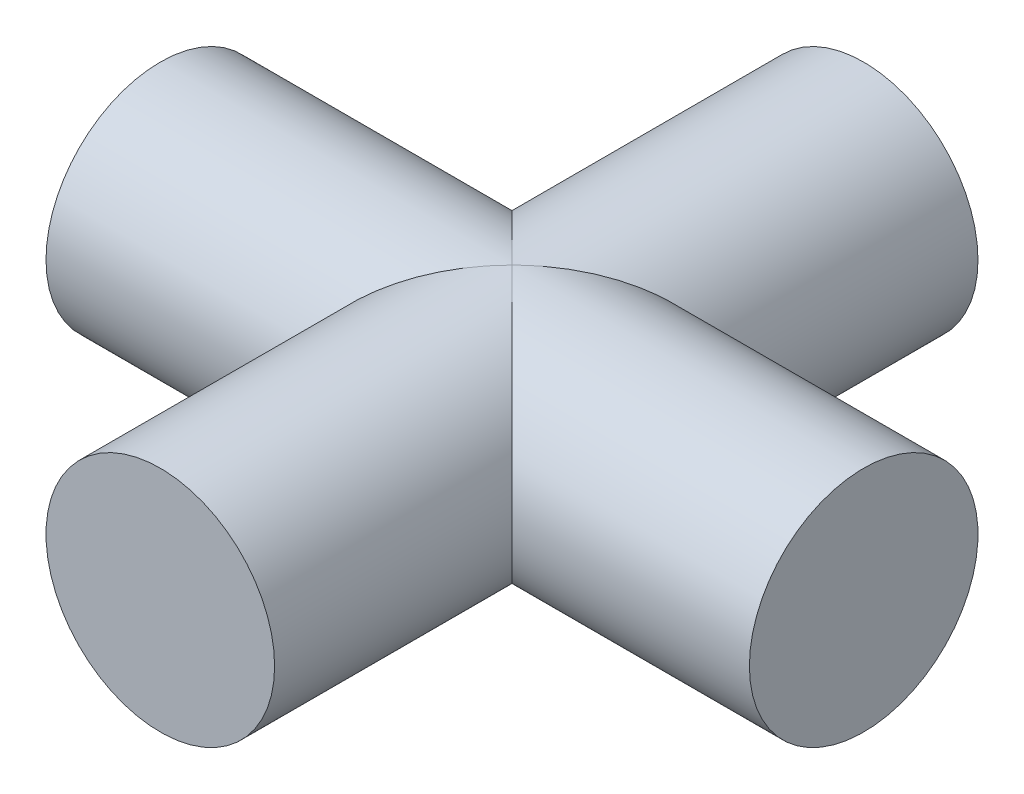
ISO-10303-21;
HEADER;
FILE_DESCRIPTION(('STEP AP214'),'2;1');
FILE_NAME('part.step','',(''),(''),'','','');
FILE_SCHEMA(('AUTOMOTIVE_DESIGN { 1 0 10303 214 1 1 1 1 }'));
ENDSEC;
DATA;
#1=APPLICATION_CONTEXT('core data for automotive mechanical design processes');
#2=APPLICATION_PROTOCOL_DEFINITION('international standard','automotive_design',2000,#1);
#3=PRODUCT_CONTEXT('',#1,'mechanical');
#4=PRODUCT('Part','Part','',(#3));
#5=PRODUCT_RELATED_PRODUCT_CATEGORY('part','',(#4));
#6=PRODUCT_DEFINITION_FORMATION('','',#4);
#7=PRODUCT_DEFINITION_CONTEXT('part definition',#1,'design');
#8=PRODUCT_DEFINITION('design','',#6,#7);
#9=PRODUCT_DEFINITION_SHAPE('','',#8);
#10=(LENGTH_UNIT() NAMED_UNIT(*) SI_UNIT(.MILLI.,.METRE.));
#11=(NAMED_UNIT(*) PLANE_ANGLE_UNIT() SI_UNIT($,.RADIAN.));
#12=(NAMED_UNIT(*) SI_UNIT($,.STERADIAN.) SOLID_ANGLE_UNIT());
#13=UNCERTAINTY_MEASURE_WITH_UNIT(LENGTH_MEASURE(1.E-05),#10,'distance_accuracy_value','');
#14=(GEOMETRIC_REPRESENTATION_CONTEXT(3) GLOBAL_UNCERTAINTY_ASSIGNED_CONTEXT((#13)) GLOBAL_UNIT_ASSIGNED_CONTEXT((#10,
#11,#12)) REPRESENTATION_CONTEXT('',''));
#15=CARTESIAN_POINT('',(0.,0.,0.));
#16=DIRECTION('',(0.,0.,1.));
#17=DIRECTION('',(1.,0.,0.));
#18=AXIS2_PLACEMENT_3D('',#15,#16,#17);
#19=CARTESIAN_POINT('',(0.,825.,-20.));
#20=DIRECTION('',(0.,0.,1.));
#21=DIRECTION('',(1.,0.,0.));
#22=AXIS2_PLACEMENT_3D('',#19,#20,#21);
#23=CYLINDRICAL_SURFACE('',#22,6.49999999999996);
#24=CARTESIAN_POINT('',(0.,825.,20.));
#25=DIRECTION('',(0.,0.,1.));
#26=DIRECTION('',(1.,0.,0.));
#27=AXIS2_PLACEMENT_3D('',#24,#25,#26);
#28=CIRCLE('',#27,6.49999999999996);
#29=CARTESIAN_POINT('',(6.49999999999998,825.,20.));
#30=VERTEX_POINT('',#29);
#31=EDGE_CURVE('E70',#30,#30,#28,.T.);
#32=ORIENTED_EDGE('',*,*,#31,.F.);
#33=EDGE_LOOP('',(#32));
#34=FACE_BOUND('',#33,.T.);
#35=CARTESIAN_POINT('',(0.,825.,0.));
#36=DIRECTION('',(-0.707106781186547,0.,0.707106781186547));
#37=DIRECTION('',(0.707106781186547,0.,0.707106781186547));
#38=AXIS2_PLACEMENT_3D('',#35,#36,#37);
#39=ELLIPSE('',#38,9.19238815542516,6.50000000000003);
#40=CARTESIAN_POINT('',(0.,818.5,0.));
#41=VERTEX_POINT('',#40);
#42=CARTESIAN_POINT('',(0.,831.5,0.));
#43=VERTEX_POINT('',#42);
#44=EDGE_CURVE('E58',#41,#43,#39,.T.);
#45=ORIENTED_EDGE('',*,*,#44,.T.);
#46=CARTESIAN_POINT('',(0.,825.,0.));
#47=DIRECTION('',(0.707106781186547,0.,0.707106781186547));
#48=DIRECTION('',(-0.707106781186547,0.,0.707106781186547));
#49=AXIS2_PLACEMENT_3D('',#46,#47,#48);
#50=ELLIPSE('',#49,9.19238815542516,6.50000000000003);
#51=EDGE_CURVE('E47',#43,#41,#50,.T.);
#52=ORIENTED_EDGE('',*,*,#51,.T.);
#53=EDGE_LOOP('',(#45,#52));
#54=FACE_BOUND('',#53,.T.);
#55=ADVANCED_FACE('F39',(#34,#54),#23,.T.);
#56=CARTESIAN_POINT('',(0.,825.,20.));
#57=DIRECTION('',(0.,0.,1.));
#58=DIRECTION('',(1.,0.,0.));
#59=AXIS2_PLACEMENT_3D('',#56,#57,#58);
#60=PLANE('',#59);
#61=ORIENTED_EDGE('',*,*,#31,.T.);
#62=EDGE_LOOP('',(#61));
#63=FACE_BOUND('',#62,.T.);
#64=ADVANCED_FACE('F91',(#63),#60,.T.);
#65=CARTESIAN_POINT('',(-20.,825.,0.));
#66=DIRECTION('',(-1.,0.,0.));
#67=DIRECTION('',(0.,0.,1.));
#68=AXIS2_PLACEMENT_3D('',#65,#66,#67);
#69=PLANE('',#68);
#70=CARTESIAN_POINT('',(-20.,825.,0.));
#71=DIRECTION('',(-1.,0.,0.));
#72=DIRECTION('',(0.,0.,1.));
#73=AXIS2_PLACEMENT_3D('',#70,#71,#72);
#74=CIRCLE('',#73,6.5000000000001);
#75=CARTESIAN_POINT('',(-20.,825.,6.50000000000009));
#76=VERTEX_POINT('',#75);
#77=EDGE_CURVE('E73',#76,#76,#74,.T.);
#78=ORIENTED_EDGE('',*,*,#77,.T.);
#79=EDGE_LOOP('',(#78));
#80=FACE_BOUND('',#79,.T.);
#81=ADVANCED_FACE('F82',(#80),#69,.T.);
#82=CARTESIAN_POINT('',(-20.,825.,0.));
#83=DIRECTION('',(1.,0.,0.));
#84=DIRECTION('',(0.,0.,-1.));
#85=AXIS2_PLACEMENT_3D('',#82,#83,#84);
#86=CYLINDRICAL_SURFACE('',#85,6.5000000000001);
#87=ORIENTED_EDGE('',*,*,#51,.F.);
#88=CARTESIAN_POINT('',(0.,825.,0.));
#89=DIRECTION('',(-0.707106781186547,0.,0.707106781186547));
#90=DIRECTION('',(0.707106781186547,0.,0.707106781186547));
#91=AXIS2_PLACEMENT_3D('',#88,#89,#90);
#92=ELLIPSE('',#91,9.19238815542516,6.50000000000003);
#93=EDGE_CURVE('E52',#41,#43,#92,.F.);
#94=ORIENTED_EDGE('',*,*,#93,.F.);
#95=EDGE_LOOP('',(#87,#94));
#96=FACE_BOUND('',#95,.T.);
#97=ORIENTED_EDGE('',*,*,#77,.F.);
#98=EDGE_LOOP('',(#97));
#99=FACE_BOUND('',#98,.T.);
#100=ADVANCED_FACE('F65',(#96,#99),#86,.T.);
#101=CARTESIAN_POINT('',(0.,825.,0.));
#102=DIRECTION('',(0.707106781186547,0.,0.707106781186547));
#103=DIRECTION('',(-0.707106781186547,0.,0.707106781186547));
#104=AXIS2_PLACEMENT_3D('',#101,#102,#103);
#105=ELLIPSE('',#104,9.19238815542516,6.50000000000003);
#106=EDGE_CURVE('E11',#43,#41,#105,.F.);
#107=ORIENTED_EDGE('',*,*,#106,.F.);
#108=ORIENTED_EDGE('',*,*,#44,.F.);
#109=EDGE_LOOP('',(#107,#108));
#110=FACE_BOUND('',#109,.T.);
#111=CARTESIAN_POINT('',(20.,825.,0.));
#112=DIRECTION('',(-1.,0.,0.));
#113=DIRECTION('',(0.,0.,1.));
#114=AXIS2_PLACEMENT_3D('',#111,#112,#113);
#115=CIRCLE('',#114,6.5000000000001);
#116=CARTESIAN_POINT('',(20.,825.,6.50000000000009));
#117=VERTEX_POINT('',#116);
#118=EDGE_CURVE('E76',#117,#117,#115,.T.);
#119=ORIENTED_EDGE('',*,*,#118,.T.);
#120=EDGE_LOOP('',(#119));
#121=FACE_BOUND('',#120,.T.);
#122=ADVANCED_FACE('F59',(#110,#121),#86,.T.);
#123=CARTESIAN_POINT('',(20.,825.,0.));
#124=DIRECTION('',(-1.,0.,0.));
#125=DIRECTION('',(0.,0.,1.));
#126=AXIS2_PLACEMENT_3D('',#123,#124,#125);
#127=PLANE('',#126);
#128=ORIENTED_EDGE('',*,*,#118,.F.);
#129=EDGE_LOOP('',(#128));
#130=FACE_BOUND('',#129,.T.);
#131=ADVANCED_FACE('F90',(#130),#127,.F.);
#132=CARTESIAN_POINT('',(0.,825.,-20.));
#133=DIRECTION('',(0.,0.,1.));
#134=DIRECTION('',(1.,0.,0.));
#135=AXIS2_PLACEMENT_3D('',#132,#133,#134);
#136=PLANE('',#135);
#137=CARTESIAN_POINT('',(0.,825.,-20.));
#138=DIRECTION('',(0.,0.,1.));
#139=DIRECTION('',(1.,0.,0.));
#140=AXIS2_PLACEMENT_3D('',#137,#138,#139);
#141=CIRCLE('',#140,6.49999999999996);
#142=CARTESIAN_POINT('',(6.49999999999998,825.,-20.));
#143=VERTEX_POINT('',#142);
#144=EDGE_CURVE('E67',#143,#143,#141,.T.);
#145=ORIENTED_EDGE('',*,*,#144,.F.);
#146=EDGE_LOOP('',(#145));
#147=FACE_BOUND('',#146,.T.);
#148=ADVANCED_FACE('F104',(#147),#136,.F.);
#149=ORIENTED_EDGE('',*,*,#144,.T.);
#150=EDGE_LOOP('',(#149));
#151=FACE_BOUND('',#150,.T.);
#152=ORIENTED_EDGE('',*,*,#93,.T.);
#153=ORIENTED_EDGE('',*,*,#106,.T.);
#154=EDGE_LOOP('',(#152,#153));
#155=FACE_BOUND('',#154,.T.);
#156=ADVANCED_FACE('F41',(#151,#155),#23,.T.);
#157=CLOSED_SHELL('',(#55,#64,#81,#100,#122,#131,#148,#156));
#158=MANIFOLD_SOLID_BREP('B2',#157);
#159=ADVANCED_BREP_SHAPE_REPRESENTATION('',(#18,#158),#14);
#160=SHAPE_DEFINITION_REPRESENTATION(#9,#159);
ENDSEC;
END-ISO-10303-21;
